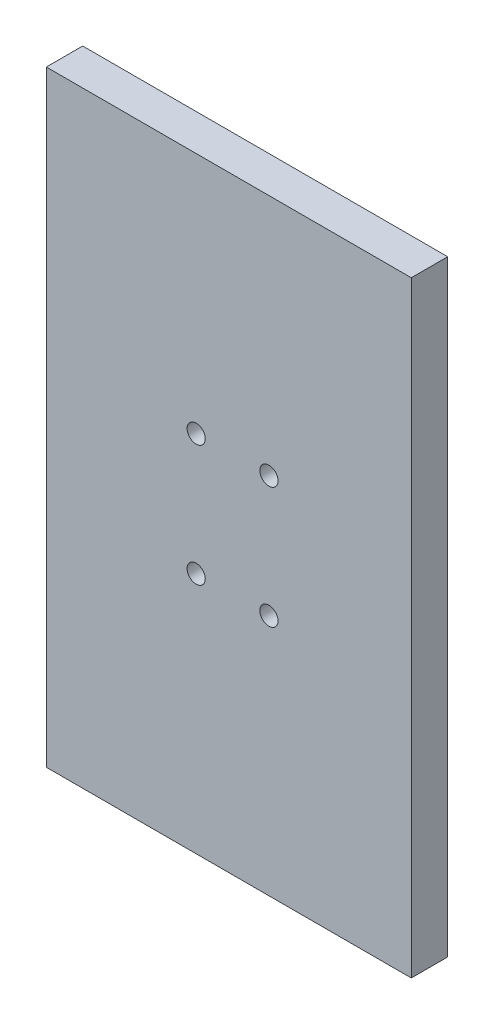
ISO-10303-21;
HEADER;
FILE_DESCRIPTION(('STEP AP214'),'2;1');
FILE_NAME('part.step','',(''),(''),'','','');
FILE_SCHEMA(('AUTOMOTIVE_DESIGN { 1 0 10303 214 1 1 1 1 }'));
ENDSEC;
DATA;
#1=APPLICATION_CONTEXT('core data for automotive mechanical design processes');
#2=APPLICATION_PROTOCOL_DEFINITION('international standard','automotive_design',2000,#1);
#3=PRODUCT_CONTEXT('',#1,'mechanical');
#4=PRODUCT('Part','Part','',(#3));
#5=PRODUCT_RELATED_PRODUCT_CATEGORY('part','',(#4));
#6=PRODUCT_DEFINITION_FORMATION('','',#4);
#7=PRODUCT_DEFINITION_CONTEXT('part definition',#1,'design');
#8=PRODUCT_DEFINITION('design','',#6,#7);
#9=PRODUCT_DEFINITION_SHAPE('','',#8);
#10=(LENGTH_UNIT() NAMED_UNIT(*) SI_UNIT(.MILLI.,.METRE.));
#11=(NAMED_UNIT(*) PLANE_ANGLE_UNIT() SI_UNIT($,.RADIAN.));
#12=(NAMED_UNIT(*) SI_UNIT($,.STERADIAN.) SOLID_ANGLE_UNIT());
#13=UNCERTAINTY_MEASURE_WITH_UNIT(LENGTH_MEASURE(1.E-05),#10,'distance_accuracy_value','');
#14=(GEOMETRIC_REPRESENTATION_CONTEXT(3) GLOBAL_UNCERTAINTY_ASSIGNED_CONTEXT((#13)) GLOBAL_UNIT_ASSIGNED_CONTEXT((#10,
#11,#12)) REPRESENTATION_CONTEXT('',''));
#15=CARTESIAN_POINT('',(0.,0.,0.));
#16=DIRECTION('',(0.,0.,1.));
#17=DIRECTION('',(1.,0.,0.));
#18=AXIS2_PLACEMENT_3D('',#15,#16,#17);
#19=CARTESIAN_POINT('',(58.9458600668756,-92.8855189967252,12.));
#20=DIRECTION('',(-1.,0.,0.));
#21=DIRECTION('',(0.,0.,1.));
#22=AXIS2_PLACEMENT_3D('',#19,#20,#21);
#23=PLANE('',#22);
#24=DIRECTION('',(0.,1.,0.));
#25=VECTOR('',#24,1.);
#26=CARTESIAN_POINT('',(58.9458600668756,-92.8855189967252,0.));
#27=LINE('',#26,#25);
#28=CARTESIAN_POINT('',(58.9458600668756,-92.8855189967252,0.));
#29=VERTEX_POINT('',#28);
#30=CARTESIAN_POINT('',(58.9458600668756,107.114481003275,0.));
#31=VERTEX_POINT('',#30);
#32=EDGE_CURVE('E99',#29,#31,#27,.T.);
#33=ORIENTED_EDGE('',*,*,#32,.T.);
#34=DIRECTION('',(0.,0.,-1.));
#35=VECTOR('',#34,1.);
#36=CARTESIAN_POINT('',(58.9458600668756,107.114481003275,12.));
#37=LINE('',#36,#35);
#38=CARTESIAN_POINT('',(58.9458600668756,107.114481003275,12.));
#39=VERTEX_POINT('',#38);
#40=EDGE_CURVE('E11',#39,#31,#37,.T.);
#41=ORIENTED_EDGE('',*,*,#40,.F.);
#42=DIRECTION('',(0.,1.,0.));
#43=VECTOR('',#42,1.);
#44=CARTESIAN_POINT('',(58.9458600668756,-92.8855189967252,12.));
#45=LINE('',#44,#43);
#46=CARTESIAN_POINT('',(58.9458600668756,-92.8855189967252,12.));
#47=VERTEX_POINT('',#46);
#48=EDGE_CURVE('E87',#47,#39,#45,.T.);
#49=ORIENTED_EDGE('',*,*,#48,.F.);
#50=DIRECTION('',(0.,0.,-1.));
#51=VECTOR('',#50,1.);
#52=CARTESIAN_POINT('',(58.9458600668756,-92.8855189967252,12.));
#53=LINE('',#52,#51);
#54=EDGE_CURVE('E95',#47,#29,#53,.T.);
#55=ORIENTED_EDGE('',*,*,#54,.T.);
#56=EDGE_LOOP('',(#33,#41,#49,#55));
#57=FACE_BOUND('',#56,.T.);
#58=ADVANCED_FACE('F36',(#57),#23,.F.);
#59=CARTESIAN_POINT('',(58.9458600668756,107.114481003275,12.));
#60=DIRECTION('',(0.,-1.,0.));
#61=DIRECTION('',(1.,0.,0.));
#62=AXIS2_PLACEMENT_3D('',#59,#60,#61);
#63=PLANE('',#62);
#64=DIRECTION('',(-1.,0.,0.));
#65=VECTOR('',#64,1.);
#66=CARTESIAN_POINT('',(58.9458600668756,107.114481003275,0.));
#67=LINE('',#66,#65);
#68=CARTESIAN_POINT('',(-61.4192787239057,107.114481003275,0.));
#69=VERTEX_POINT('',#68);
#70=EDGE_CURVE('E91',#31,#69,#67,.T.);
#71=ORIENTED_EDGE('',*,*,#70,.T.);
#72=DIRECTION('',(0.,0.,-1.));
#73=VECTOR('',#72,1.);
#74=CARTESIAN_POINT('',(-61.4192787239057,107.114481003275,12.));
#75=LINE('',#74,#73);
#76=CARTESIAN_POINT('',(-61.4192787239057,107.114481003275,12.));
#77=VERTEX_POINT('',#76);
#78=EDGE_CURVE('E44',#77,#69,#75,.T.);
#79=ORIENTED_EDGE('',*,*,#78,.F.);
#80=DIRECTION('',(-1.,0.,0.));
#81=VECTOR('',#80,1.);
#82=CARTESIAN_POINT('',(58.9458600668756,107.114481003275,12.));
#83=LINE('',#82,#81);
#84=EDGE_CURVE('E82',#39,#77,#83,.T.);
#85=ORIENTED_EDGE('',*,*,#84,.F.);
#86=ORIENTED_EDGE('',*,*,#40,.T.);
#87=EDGE_LOOP('',(#71,#79,#85,#86));
#88=FACE_BOUND('',#87,.T.);
#89=ADVANCED_FACE('F90',(#88),#63,.F.);
#90=CARTESIAN_POINT('',(-61.4192787239057,-92.8855189967253,12.));
#91=DIRECTION('',(1.,0.,0.));
#92=DIRECTION('',(0.,0.,-1.));
#93=AXIS2_PLACEMENT_3D('',#90,#91,#92);
#94=PLANE('',#93);
#95=DIRECTION('',(0.,-1.,0.));
#96=VECTOR('',#95,1.);
#97=CARTESIAN_POINT('',(-61.4192787239057,-92.8855189967253,0.));
#98=LINE('',#97,#96);
#99=CARTESIAN_POINT('',(-61.4192787239057,-92.8855189967253,0.));
#100=VERTEX_POINT('',#99);
#101=EDGE_CURVE('E69',#69,#100,#98,.T.);
#102=ORIENTED_EDGE('',*,*,#101,.T.);
#103=DIRECTION('',(0.,0.,-1.));
#104=VECTOR('',#103,1.);
#105=CARTESIAN_POINT('',(-61.4192787239057,-92.8855189967253,12.));
#106=LINE('',#105,#104);
#107=CARTESIAN_POINT('',(-61.4192787239057,-92.8855189967253,12.));
#108=VERTEX_POINT('',#107);
#109=EDGE_CURVE('E92',#108,#100,#106,.T.);
#110=ORIENTED_EDGE('',*,*,#109,.F.);
#111=DIRECTION('',(0.,-1.,0.));
#112=VECTOR('',#111,1.);
#113=CARTESIAN_POINT('',(-61.4192787239057,-92.8855189967253,12.));
#114=LINE('',#113,#112);
#115=EDGE_CURVE('E85',#77,#108,#114,.T.);
#116=ORIENTED_EDGE('',*,*,#115,.F.);
#117=ORIENTED_EDGE('',*,*,#78,.T.);
#118=EDGE_LOOP('',(#102,#110,#116,#117));
#119=FACE_BOUND('',#118,.T.);
#120=ADVANCED_FACE('F93',(#119),#94,.F.);
#121=CARTESIAN_POINT('',(58.9458600668756,-92.8855189967252,12.));
#122=DIRECTION('',(0.,1.,0.));
#123=DIRECTION('',(-1.,0.,0.));
#124=AXIS2_PLACEMENT_3D('',#121,#122,#123);
#125=PLANE('',#124);
#126=DIRECTION('',(1.,0.,0.));
#127=VECTOR('',#126,1.);
#128=CARTESIAN_POINT('',(58.9458600668756,-92.8855189967252,0.));
#129=LINE('',#128,#127);
#130=EDGE_CURVE('E75',#100,#29,#129,.T.);
#131=ORIENTED_EDGE('',*,*,#130,.T.);
#132=ORIENTED_EDGE('',*,*,#54,.F.);
#133=DIRECTION('',(1.,0.,0.));
#134=VECTOR('',#133,1.);
#135=CARTESIAN_POINT('',(58.9458600668756,-92.8855189967252,12.));
#136=LINE('',#135,#134);
#137=EDGE_CURVE('E52',#108,#47,#136,.T.);
#138=ORIENTED_EDGE('',*,*,#137,.F.);
#139=ORIENTED_EDGE('',*,*,#109,.T.);
#140=EDGE_LOOP('',(#131,#132,#138,#139));
#141=FACE_BOUND('',#140,.T.);
#142=ADVANCED_FACE('F107',(#141),#125,.F.);
#143=CARTESIAN_POINT('',(0.,0.,12.));
#144=DIRECTION('',(0.,0.,1.));
#145=DIRECTION('',(1.,0.,0.));
#146=AXIS2_PLACEMENT_3D('',#143,#144,#145);
#147=PLANE('',#146);
#148=CARTESIAN_POINT('',(12.,27.1144810032748,12.));
#149=DIRECTION('',(0.,0.,1.));
#150=DIRECTION('',(1.,0.,0.));
#151=AXIS2_PLACEMENT_3D('',#148,#149,#150);
#152=CIRCLE('',#151,3.);
#153=CARTESIAN_POINT('',(15.,27.1144810032748,12.));
#154=VERTEX_POINT('',#153);
#155=EDGE_CURVE('E122',#154,#154,#152,.T.);
#156=ORIENTED_EDGE('',*,*,#155,.F.);
#157=EDGE_LOOP('',(#156));
#158=FACE_BOUND('',#157,.T.);
#159=CARTESIAN_POINT('',(-12.,-12.8855189967252,12.));
#160=DIRECTION('',(0.,0.,1.));
#161=DIRECTION('',(1.,0.,0.));
#162=AXIS2_PLACEMENT_3D('',#159,#160,#161);
#163=CIRCLE('',#162,3.);
#164=CARTESIAN_POINT('',(-8.99999999999998,-12.8855189967252,12.));
#165=VERTEX_POINT('',#164);
#166=EDGE_CURVE('E123',#165,#165,#163,.T.);
#167=ORIENTED_EDGE('',*,*,#166,.F.);
#168=EDGE_LOOP('',(#167));
#169=FACE_BOUND('',#168,.T.);
#170=CARTESIAN_POINT('',(12.,-12.8855189967252,12.));
#171=DIRECTION('',(0.,0.,1.));
#172=DIRECTION('',(1.,0.,0.));
#173=AXIS2_PLACEMENT_3D('',#170,#171,#172);
#174=CIRCLE('',#173,3.);
#175=CARTESIAN_POINT('',(15.,-12.8855189967252,12.));
#176=VERTEX_POINT('',#175);
#177=EDGE_CURVE('E133',#176,#176,#174,.T.);
#178=ORIENTED_EDGE('',*,*,#177,.F.);
#179=EDGE_LOOP('',(#178));
#180=FACE_BOUND('',#179,.T.);
#181=CARTESIAN_POINT('',(-12.,27.1144810032748,12.));
#182=DIRECTION('',(0.,0.,1.));
#183=DIRECTION('',(1.,0.,0.));
#184=AXIS2_PLACEMENT_3D('',#181,#182,#183);
#185=CIRCLE('',#184,3.);
#186=CARTESIAN_POINT('',(-8.99999999999997,27.1144810032748,12.));
#187=VERTEX_POINT('',#186);
#188=EDGE_CURVE('E115',#187,#187,#185,.T.);
#189=ORIENTED_EDGE('',*,*,#188,.F.);
#190=EDGE_LOOP('',(#189));
#191=FACE_BOUND('',#190,.T.);
#192=ORIENTED_EDGE('',*,*,#48,.T.);
#193=ORIENTED_EDGE('',*,*,#84,.T.);
#194=ORIENTED_EDGE('',*,*,#115,.T.);
#195=ORIENTED_EDGE('',*,*,#137,.T.);
#196=EDGE_LOOP('',(#192,#193,#194,#195));
#197=FACE_BOUND('',#196,.T.);
#198=ADVANCED_FACE('F83',(#158,#169,#180,#191,#197),#147,.T.);
#199=CARTESIAN_POINT('',(0.,0.,0.));
#200=DIRECTION('',(0.,0.,1.));
#201=DIRECTION('',(1.,0.,0.));
#202=AXIS2_PLACEMENT_3D('',#199,#200,#201);
#203=PLANE('',#202);
#204=CARTESIAN_POINT('',(12.,27.1144810032748,0.));
#205=DIRECTION('',(0.,0.,1.));
#206=DIRECTION('',(1.,0.,0.));
#207=AXIS2_PLACEMENT_3D('',#204,#205,#206);
#208=CIRCLE('',#207,3.);
#209=CARTESIAN_POINT('',(15.,27.1144810032748,0.));
#210=VERTEX_POINT('',#209);
#211=EDGE_CURVE('E118',#210,#210,#208,.F.);
#212=ORIENTED_EDGE('',*,*,#211,.F.);
#213=EDGE_LOOP('',(#212));
#214=FACE_BOUND('',#213,.T.);
#215=CARTESIAN_POINT('',(-12.,-12.8855189967252,0.));
#216=DIRECTION('',(0.,0.,1.));
#217=DIRECTION('',(1.,0.,0.));
#218=AXIS2_PLACEMENT_3D('',#215,#216,#217);
#219=CIRCLE('',#218,3.);
#220=CARTESIAN_POINT('',(-8.99999999999998,-12.8855189967252,0.));
#221=VERTEX_POINT('',#220);
#222=EDGE_CURVE('E119',#221,#221,#219,.F.);
#223=ORIENTED_EDGE('',*,*,#222,.F.);
#224=EDGE_LOOP('',(#223));
#225=FACE_BOUND('',#224,.T.);
#226=CARTESIAN_POINT('',(12.,-12.8855189967252,0.));
#227=DIRECTION('',(0.,0.,1.));
#228=DIRECTION('',(1.,0.,0.));
#229=AXIS2_PLACEMENT_3D('',#226,#227,#228);
#230=CIRCLE('',#229,3.);
#231=CARTESIAN_POINT('',(15.,-12.8855189967252,0.));
#232=VERTEX_POINT('',#231);
#233=EDGE_CURVE('E126',#232,#232,#230,.F.);
#234=ORIENTED_EDGE('',*,*,#233,.F.);
#235=EDGE_LOOP('',(#234));
#236=FACE_BOUND('',#235,.T.);
#237=CARTESIAN_POINT('',(-12.,27.1144810032748,0.));
#238=DIRECTION('',(0.,0.,1.));
#239=DIRECTION('',(1.,0.,0.));
#240=AXIS2_PLACEMENT_3D('',#237,#238,#239);
#241=CIRCLE('',#240,3.);
#242=CARTESIAN_POINT('',(-8.99999999999997,27.1144810032748,0.));
#243=VERTEX_POINT('',#242);
#244=EDGE_CURVE('E102',#243,#243,#241,.F.);
#245=ORIENTED_EDGE('',*,*,#244,.F.);
#246=EDGE_LOOP('',(#245));
#247=FACE_BOUND('',#246,.T.);
#248=ORIENTED_EDGE('',*,*,#32,.F.);
#249=ORIENTED_EDGE('',*,*,#130,.F.);
#250=ORIENTED_EDGE('',*,*,#101,.F.);
#251=ORIENTED_EDGE('',*,*,#70,.F.);
#252=EDGE_LOOP('',(#248,#249,#250,#251));
#253=FACE_BOUND('',#252,.T.);
#254=ADVANCED_FACE('F110',(#214,#225,#236,#247,#253),#203,.F.);
#255=CARTESIAN_POINT('',(-12.,27.1144810032748,-0.000999999999999265));
#256=DIRECTION('',(0.,0.,1.));
#257=DIRECTION('',(1.,0.,0.));
#258=AXIS2_PLACEMENT_3D('',#255,#256,#257);
#259=CYLINDRICAL_SURFACE('',#258,3.);
#260=ORIENTED_EDGE('',*,*,#188,.T.);
#261=EDGE_LOOP('',(#260));
#262=FACE_BOUND('',#261,.T.);
#263=ORIENTED_EDGE('',*,*,#244,.T.);
#264=EDGE_LOOP('',(#263));
#265=FACE_BOUND('',#264,.T.);
#266=ADVANCED_FACE('F146',(#262,#265),#259,.F.);
#267=CARTESIAN_POINT('',(12.,-12.8855189967252,-0.000999999999999265));
#268=DIRECTION('',(0.,0.,1.));
#269=DIRECTION('',(1.,0.,0.));
#270=AXIS2_PLACEMENT_3D('',#267,#268,#269);
#271=CYLINDRICAL_SURFACE('',#270,3.);
#272=ORIENTED_EDGE('',*,*,#177,.T.);
#273=EDGE_LOOP('',(#272));
#274=FACE_BOUND('',#273,.T.);
#275=ORIENTED_EDGE('',*,*,#233,.T.);
#276=EDGE_LOOP('',(#275));
#277=FACE_BOUND('',#276,.T.);
#278=ADVANCED_FACE('F137',(#274,#277),#271,.F.);
#279=CARTESIAN_POINT('',(-12.,-12.8855189967252,-0.000999999999999265));
#280=DIRECTION('',(0.,0.,1.));
#281=DIRECTION('',(1.,0.,0.));
#282=AXIS2_PLACEMENT_3D('',#279,#280,#281);
#283=CYLINDRICAL_SURFACE('',#282,3.);
#284=ORIENTED_EDGE('',*,*,#166,.T.);
#285=EDGE_LOOP('',(#284));
#286=FACE_BOUND('',#285,.T.);
#287=ORIENTED_EDGE('',*,*,#222,.T.);
#288=EDGE_LOOP('',(#287));
#289=FACE_BOUND('',#288,.T.);
#290=ADVANCED_FACE('F196',(#286,#289),#283,.F.);
#291=CARTESIAN_POINT('',(12.,27.1144810032748,-0.000999999999999265));
#292=DIRECTION('',(0.,0.,1.));
#293=DIRECTION('',(1.,0.,0.));
#294=AXIS2_PLACEMENT_3D('',#291,#292,#293);
#295=CYLINDRICAL_SURFACE('',#294,3.);
#296=ORIENTED_EDGE('',*,*,#155,.T.);
#297=EDGE_LOOP('',(#296));
#298=FACE_BOUND('',#297,.T.);
#299=ORIENTED_EDGE('',*,*,#211,.T.);
#300=EDGE_LOOP('',(#299));
#301=FACE_BOUND('',#300,.T.);
#302=ADVANCED_FACE('F205',(#298,#301),#295,.F.);
#303=CLOSED_SHELL('',(#58,#89,#120,#142,#198,#254,#266,#278,#290,#302));
#304=MANIFOLD_SOLID_BREP('B2',#303);
#305=ADVANCED_BREP_SHAPE_REPRESENTATION('',(#18,#304),#14);
#306=SHAPE_DEFINITION_REPRESENTATION(#9,#305);
ENDSEC;
END-ISO-10303-21;
